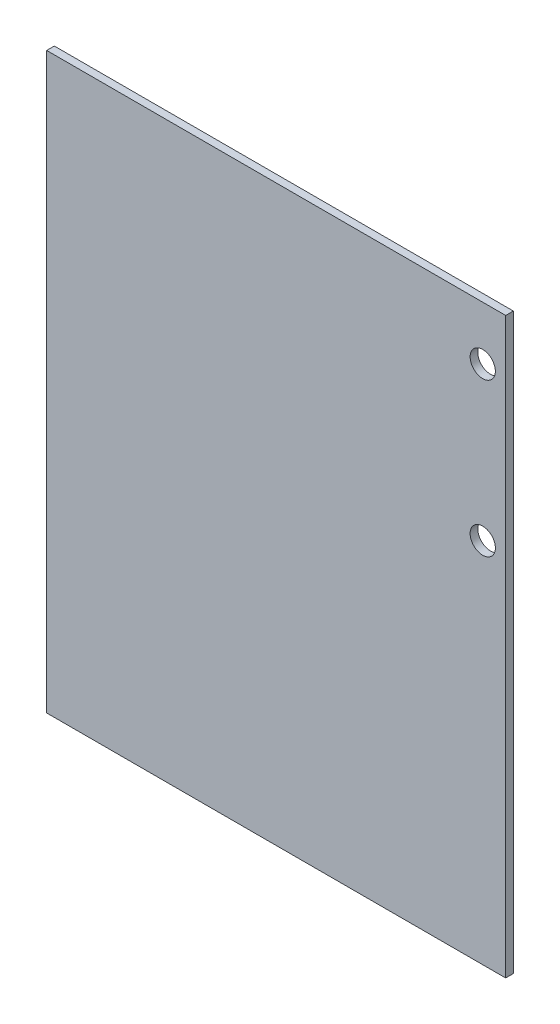
ISO-10303-21;
HEADER;
FILE_DESCRIPTION(('STEP AP214'),'2;1');
FILE_NAME('part.step','',(''),(''),'','','');
FILE_SCHEMA(('AUTOMOTIVE_DESIGN { 1 0 10303 214 1 1 1 1 }'));
ENDSEC;
DATA;
#1=APPLICATION_CONTEXT('core data for automotive mechanical design processes');
#2=APPLICATION_PROTOCOL_DEFINITION('international standard','automotive_design',2000,#1);
#3=PRODUCT_CONTEXT('',#1,'mechanical');
#4=PRODUCT('Part','Part','',(#3));
#5=PRODUCT_RELATED_PRODUCT_CATEGORY('part','',(#4));
#6=PRODUCT_DEFINITION_FORMATION('','',#4);
#7=PRODUCT_DEFINITION_CONTEXT('part definition',#1,'design');
#8=PRODUCT_DEFINITION('design','',#6,#7);
#9=PRODUCT_DEFINITION_SHAPE('','',#8);
#10=(LENGTH_UNIT() NAMED_UNIT(*) SI_UNIT(.MILLI.,.METRE.));
#11=(NAMED_UNIT(*) PLANE_ANGLE_UNIT() SI_UNIT($,.RADIAN.));
#12=(NAMED_UNIT(*) SI_UNIT($,.STERADIAN.) SOLID_ANGLE_UNIT());
#13=UNCERTAINTY_MEASURE_WITH_UNIT(LENGTH_MEASURE(1.E-05),#10,'distance_accuracy_value','');
#14=(GEOMETRIC_REPRESENTATION_CONTEXT(3) GLOBAL_UNCERTAINTY_ASSIGNED_CONTEXT((#13)) GLOBAL_UNIT_ASSIGNED_CONTEXT((#10,
#11,#12)) REPRESENTATION_CONTEXT('',''));
#15=CARTESIAN_POINT('',(0.,0.,0.));
#16=DIRECTION('',(0.,0.,1.));
#17=DIRECTION('',(1.,0.,0.));
#18=AXIS2_PLACEMENT_3D('',#15,#16,#17);
#19=CARTESIAN_POINT('',(30.,37.5,1.));
#20=DIRECTION('',(-1.,0.,0.));
#21=DIRECTION('',(0.,-1.,0.));
#22=AXIS2_PLACEMENT_3D('',#19,#20,#21);
#23=PLANE('',#22);
#24=DIRECTION('',(0.,1.,0.));
#25=VECTOR('',#24,1.);
#26=CARTESIAN_POINT('',(30.,37.5,0.));
#27=LINE('',#26,#25);
#28=CARTESIAN_POINT('',(30.,-37.5,0.));
#29=VERTEX_POINT('',#28);
#30=CARTESIAN_POINT('',(30.,37.5,0.));
#31=VERTEX_POINT('',#30);
#32=EDGE_CURVE('E128',#29,#31,#27,.T.);
#33=ORIENTED_EDGE('',*,*,#32,.T.);
#34=DIRECTION('',(0.,0.,-1.));
#35=VECTOR('',#34,1.);
#36=CARTESIAN_POINT('',(30.,37.5,1.));
#37=LINE('',#36,#35);
#38=CARTESIAN_POINT('',(30.,37.5,1.));
#39=VERTEX_POINT('',#38);
#40=EDGE_CURVE('E12',#39,#31,#37,.T.);
#41=ORIENTED_EDGE('',*,*,#40,.F.);
#42=DIRECTION('',(0.,1.,0.));
#43=VECTOR('',#42,1.);
#44=CARTESIAN_POINT('',(30.,37.5,1.));
#45=LINE('',#44,#43);
#46=CARTESIAN_POINT('',(30.,-37.5,1.));
#47=VERTEX_POINT('',#46);
#48=EDGE_CURVE('E95',#47,#39,#45,.T.);
#49=ORIENTED_EDGE('',*,*,#48,.F.);
#50=DIRECTION('',(0.,0.,-1.));
#51=VECTOR('',#50,1.);
#52=CARTESIAN_POINT('',(30.,-37.5,1.));
#53=LINE('',#52,#51);
#54=EDGE_CURVE('E103',#47,#29,#53,.T.);
#55=ORIENTED_EDGE('',*,*,#54,.T.);
#56=EDGE_LOOP('',(#33,#41,#49,#55));
#57=FACE_BOUND('',#56,.T.);
#58=ADVANCED_FACE('F44',(#57),#23,.F.);
#59=CARTESIAN_POINT('',(-30.,37.5,1.));
#60=DIRECTION('',(0.,-1.,0.));
#61=DIRECTION('',(0.,0.,-1.));
#62=AXIS2_PLACEMENT_3D('',#59,#60,#61);
#63=PLANE('',#62);
#64=DIRECTION('',(-1.,0.,0.));
#65=VECTOR('',#64,1.);
#66=CARTESIAN_POINT('',(-30.,37.5,0.));
#67=LINE('',#66,#65);
#68=CARTESIAN_POINT('',(-30.,37.5,0.));
#69=VERTEX_POINT('',#68);
#70=EDGE_CURVE('E99',#31,#69,#67,.T.);
#71=ORIENTED_EDGE('',*,*,#70,.T.);
#72=DIRECTION('',(0.,0.,-1.));
#73=VECTOR('',#72,1.);
#74=CARTESIAN_POINT('',(-30.,37.5,1.));
#75=LINE('',#74,#73);
#76=CARTESIAN_POINT('',(-30.,37.5,1.));
#77=VERTEX_POINT('',#76);
#78=EDGE_CURVE('E52',#77,#69,#75,.T.);
#79=ORIENTED_EDGE('',*,*,#78,.F.);
#80=DIRECTION('',(-1.,0.,0.));
#81=VECTOR('',#80,1.);
#82=CARTESIAN_POINT('',(-30.,37.5,1.));
#83=LINE('',#82,#81);
#84=EDGE_CURVE('E90',#39,#77,#83,.T.);
#85=ORIENTED_EDGE('',*,*,#84,.F.);
#86=ORIENTED_EDGE('',*,*,#40,.T.);
#87=EDGE_LOOP('',(#71,#79,#85,#86));
#88=FACE_BOUND('',#87,.T.);
#89=ADVANCED_FACE('F98',(#88),#63,.F.);
#90=CARTESIAN_POINT('',(-30.,37.5,1.));
#91=DIRECTION('',(1.,0.,0.));
#92=DIRECTION('',(0.,1.,0.));
#93=AXIS2_PLACEMENT_3D('',#90,#91,#92);
#94=PLANE('',#93);
#95=DIRECTION('',(0.,-1.,0.));
#96=VECTOR('',#95,1.);
#97=CARTESIAN_POINT('',(-30.,37.5,0.));
#98=LINE('',#97,#96);
#99=CARTESIAN_POINT('',(-30.,-37.5,0.));
#100=VERTEX_POINT('',#99);
#101=EDGE_CURVE('E77',#69,#100,#98,.T.);
#102=ORIENTED_EDGE('',*,*,#101,.T.);
#103=DIRECTION('',(0.,0.,-1.));
#104=VECTOR('',#103,1.);
#105=CARTESIAN_POINT('',(-30.,-37.5,1.));
#106=LINE('',#105,#104);
#107=CARTESIAN_POINT('',(-30.,-37.5,1.));
#108=VERTEX_POINT('',#107);
#109=EDGE_CURVE('E100',#108,#100,#106,.T.);
#110=ORIENTED_EDGE('',*,*,#109,.F.);
#111=DIRECTION('',(0.,-1.,0.));
#112=VECTOR('',#111,1.);
#113=CARTESIAN_POINT('',(-30.,37.5,1.));
#114=LINE('',#113,#112);
#115=EDGE_CURVE('E93',#77,#108,#114,.T.);
#116=ORIENTED_EDGE('',*,*,#115,.F.);
#117=ORIENTED_EDGE('',*,*,#78,.T.);
#118=EDGE_LOOP('',(#102,#110,#116,#117));
#119=FACE_BOUND('',#118,.T.);
#120=ADVANCED_FACE('F101',(#119),#94,.F.);
#121=CARTESIAN_POINT('',(-30.,-37.5,1.));
#122=DIRECTION('',(0.,1.,0.));
#123=DIRECTION('',(0.,0.,1.));
#124=AXIS2_PLACEMENT_3D('',#121,#122,#123);
#125=PLANE('',#124);
#126=DIRECTION('',(1.,0.,0.));
#127=VECTOR('',#126,1.);
#128=CARTESIAN_POINT('',(-30.,-37.5,0.));
#129=LINE('',#128,#127);
#130=EDGE_CURVE('E83',#100,#29,#129,.T.);
#131=ORIENTED_EDGE('',*,*,#130,.T.);
#132=ORIENTED_EDGE('',*,*,#54,.F.);
#133=DIRECTION('',(1.,0.,0.));
#134=VECTOR('',#133,1.);
#135=CARTESIAN_POINT('',(-30.,-37.5,1.));
#136=LINE('',#135,#134);
#137=EDGE_CURVE('E60',#108,#47,#136,.T.);
#138=ORIENTED_EDGE('',*,*,#137,.F.);
#139=ORIENTED_EDGE('',*,*,#109,.T.);
#140=EDGE_LOOP('',(#131,#132,#138,#139));
#141=FACE_BOUND('',#140,.T.);
#142=ADVANCED_FACE('F139',(#141),#125,.F.);
#143=CARTESIAN_POINT('',(0.,0.,1.));
#144=DIRECTION('',(0.,0.,1.));
#145=DIRECTION('',(1.,0.,0.));
#146=AXIS2_PLACEMENT_3D('',#143,#144,#145);
#147=PLANE('',#146);
#148=CARTESIAN_POINT('',(27.,30.5,1.));
#149=DIRECTION('',(0.,0.,1.));
#150=DIRECTION('',(1.,0.,0.));
#151=AXIS2_PLACEMENT_3D('',#148,#149,#150);
#152=CIRCLE('',#151,1.65);
#153=CARTESIAN_POINT('',(28.65,30.5,1.));
#154=VERTEX_POINT('',#153);
#155=EDGE_CURVE('E122',#154,#154,#152,.T.);
#156=ORIENTED_EDGE('',*,*,#155,.F.);
#157=EDGE_LOOP('',(#156));
#158=FACE_BOUND('',#157,.T.);
#159=CARTESIAN_POINT('',(27.,10.5,1.));
#160=DIRECTION('',(0.,0.,1.));
#161=DIRECTION('',(1.,0.,0.));
#162=AXIS2_PLACEMENT_3D('',#159,#160,#161);
#163=CIRCLE('',#162,1.65);
#164=CARTESIAN_POINT('',(28.65,10.5,1.));
#165=VERTEX_POINT('',#164);
#166=EDGE_CURVE('E118',#165,#165,#163,.T.);
#167=ORIENTED_EDGE('',*,*,#166,.F.);
#168=EDGE_LOOP('',(#167));
#169=FACE_BOUND('',#168,.T.);
#170=ORIENTED_EDGE('',*,*,#48,.T.);
#171=ORIENTED_EDGE('',*,*,#84,.T.);
#172=ORIENTED_EDGE('',*,*,#115,.T.);
#173=ORIENTED_EDGE('',*,*,#137,.T.);
#174=EDGE_LOOP('',(#170,#171,#172,#173));
#175=FACE_BOUND('',#174,.T.);
#176=ADVANCED_FACE('F91',(#158,#169,#175),#147,.T.);
#177=CARTESIAN_POINT('',(0.,0.,0.));
#178=DIRECTION('',(0.,0.,1.));
#179=DIRECTION('',(1.,0.,0.));
#180=AXIS2_PLACEMENT_3D('',#177,#178,#179);
#181=PLANE('',#180);
#182=CARTESIAN_POINT('',(27.,30.5,0.));
#183=DIRECTION('',(0.,0.,1.));
#184=DIRECTION('',(1.,0.,0.));
#185=AXIS2_PLACEMENT_3D('',#182,#183,#184);
#186=CIRCLE('',#185,1.65);
#187=CARTESIAN_POINT('',(28.65,30.5,0.));
#188=VERTEX_POINT('',#187);
#189=EDGE_CURVE('E126',#188,#188,#186,.T.);
#190=ORIENTED_EDGE('',*,*,#189,.T.);
#191=EDGE_LOOP('',(#190));
#192=FACE_BOUND('',#191,.T.);
#193=CARTESIAN_POINT('',(27.,10.5,0.));
#194=DIRECTION('',(0.,0.,1.));
#195=DIRECTION('',(1.,0.,0.));
#196=AXIS2_PLACEMENT_3D('',#193,#194,#195);
#197=CIRCLE('',#196,1.65);
#198=CARTESIAN_POINT('',(28.65,10.5,0.));
#199=VERTEX_POINT('',#198);
#200=EDGE_CURVE('E116',#199,#199,#197,.T.);
#201=ORIENTED_EDGE('',*,*,#200,.T.);
#202=EDGE_LOOP('',(#201));
#203=FACE_BOUND('',#202,.T.);
#204=ORIENTED_EDGE('',*,*,#32,.F.);
#205=ORIENTED_EDGE('',*,*,#130,.F.);
#206=ORIENTED_EDGE('',*,*,#101,.F.);
#207=ORIENTED_EDGE('',*,*,#70,.F.);
#208=EDGE_LOOP('',(#204,#205,#206,#207));
#209=FACE_BOUND('',#208,.T.);
#210=ADVANCED_FACE('F141',(#192,#203,#209),#181,.F.);
#211=CARTESIAN_POINT('',(27.,10.5,0.));
#212=DIRECTION('',(0.,0.,1.));
#213=DIRECTION('',(1.,0.,0.));
#214=AXIS2_PLACEMENT_3D('',#211,#212,#213);
#215=CYLINDRICAL_SURFACE('',#214,1.65);
#216=ORIENTED_EDGE('',*,*,#200,.F.);
#217=EDGE_LOOP('',(#216));
#218=FACE_BOUND('',#217,.T.);
#219=ORIENTED_EDGE('',*,*,#166,.T.);
#220=EDGE_LOOP('',(#219));
#221=FACE_BOUND('',#220,.T.);
#222=ADVANCED_FACE('F155',(#218,#221),#215,.F.);
#223=CARTESIAN_POINT('',(27.,30.5,0.));
#224=DIRECTION('',(0.,0.,1.));
#225=DIRECTION('',(1.,0.,0.));
#226=AXIS2_PLACEMENT_3D('',#223,#224,#225);
#227=CYLINDRICAL_SURFACE('',#226,1.65);
#228=ORIENTED_EDGE('',*,*,#189,.F.);
#229=EDGE_LOOP('',(#228));
#230=FACE_BOUND('',#229,.T.);
#231=ORIENTED_EDGE('',*,*,#155,.T.);
#232=EDGE_LOOP('',(#231));
#233=FACE_BOUND('',#232,.T.);
#234=ADVANCED_FACE('F161',(#230,#233),#227,.F.);
#235=CLOSED_SHELL('',(#58,#89,#120,#142,#176,#210,#222,#234));
#236=MANIFOLD_SOLID_BREP('B2',#235);
#237=ADVANCED_BREP_SHAPE_REPRESENTATION('',(#18,#236),#14);
#238=SHAPE_DEFINITION_REPRESENTATION(#9,#237);
ENDSEC;
END-ISO-10303-21;
